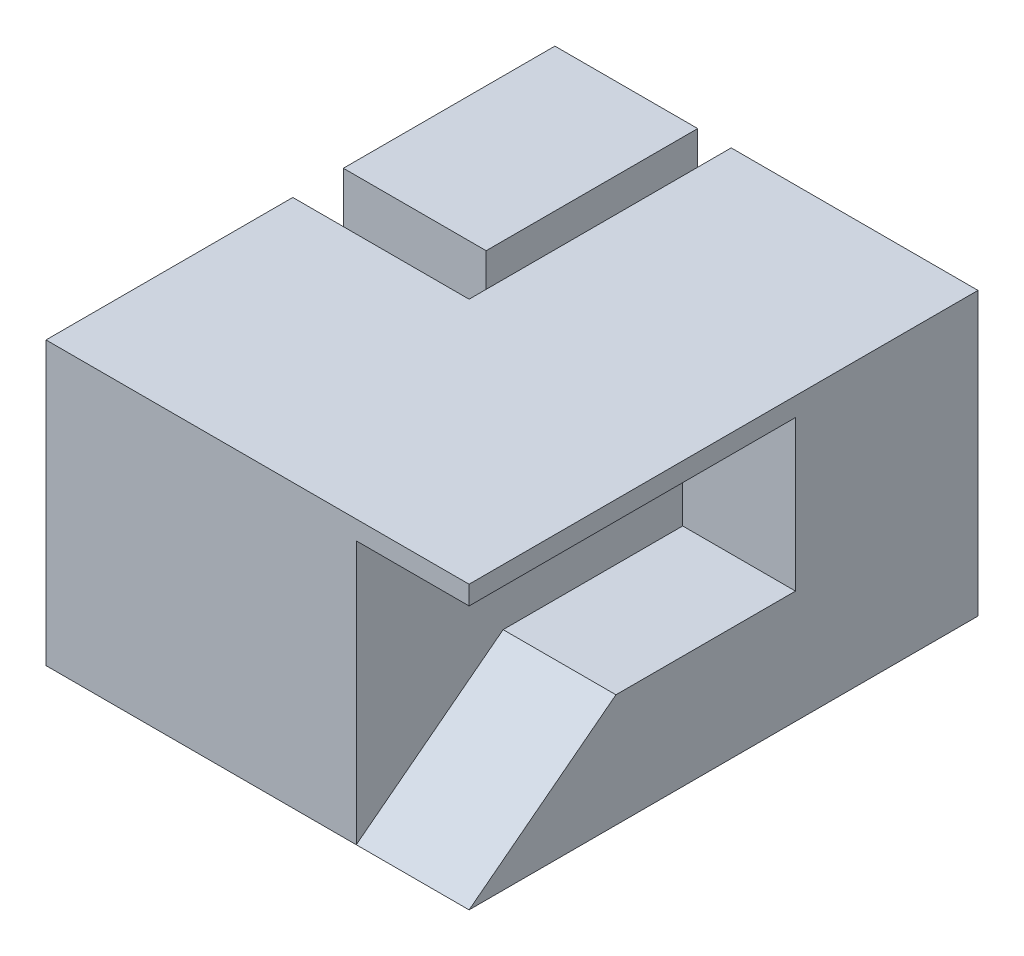
ISO-10303-21;
HEADER;
FILE_DESCRIPTION(('STEP AP214'),'2;1');
FILE_NAME('part.step','',(''),(''),'','','');
FILE_SCHEMA(('AUTOMOTIVE_DESIGN { 1 0 10303 214 1 1 1 1 }'));
ENDSEC;
DATA;
#1=APPLICATION_CONTEXT('core data for automotive mechanical design processes');
#2=APPLICATION_PROTOCOL_DEFINITION('international standard','automotive_design',2000,#1);
#3=PRODUCT_CONTEXT('',#1,'mechanical');
#4=PRODUCT('Part','Part','',(#3));
#5=PRODUCT_RELATED_PRODUCT_CATEGORY('part','',(#4));
#6=PRODUCT_DEFINITION_FORMATION('','',#4);
#7=PRODUCT_DEFINITION_CONTEXT('part definition',#1,'design');
#8=PRODUCT_DEFINITION('design','',#6,#7);
#9=PRODUCT_DEFINITION_SHAPE('','',#8);
#10=(LENGTH_UNIT() NAMED_UNIT(*) SI_UNIT(.MILLI.,.METRE.));
#11=(NAMED_UNIT(*) PLANE_ANGLE_UNIT() SI_UNIT($,.RADIAN.));
#12=(NAMED_UNIT(*) SI_UNIT($,.STERADIAN.) SOLID_ANGLE_UNIT());
#13=UNCERTAINTY_MEASURE_WITH_UNIT(LENGTH_MEASURE(1.E-05),#10,'distance_accuracy_value','');
#14=(GEOMETRIC_REPRESENTATION_CONTEXT(3) GLOBAL_UNCERTAINTY_ASSIGNED_CONTEXT((#13)) GLOBAL_UNIT_ASSIGNED_CONTEXT((#10,
#11,#12)) REPRESENTATION_CONTEXT('',''));
#15=CARTESIAN_POINT('',(0.,0.,0.));
#16=DIRECTION('',(0.,0.,1.));
#17=DIRECTION('',(1.,0.,0.));
#18=AXIS2_PLACEMENT_3D('',#15,#16,#17);
#19=CARTESIAN_POINT('',(-53.8660466781411,40.,-51.3447114218906));
#20=DIRECTION('',(1.,0.,0.));
#21=DIRECTION('',(0.,0.,-1.));
#22=AXIS2_PLACEMENT_3D('',#19,#20,#21);
#23=PLANE('',#22);
#24=DIRECTION('',(0.,0.,1.));
#25=VECTOR('',#24,1.);
#26=CARTESIAN_POINT('',(-53.8660466781411,0.,-51.3447114218906));
#27=LINE('',#26,#25);
#28=CARTESIAN_POINT('',(-53.8660466781411,0.,-51.3447114218906));
#29=VERTEX_POINT('',#28);
#30=CARTESIAN_POINT('',(-53.8660466781411,0.,-21.3447114218906));
#31=VERTEX_POINT('',#30);
#32=EDGE_CURVE('E108',#29,#31,#27,.T.);
#33=ORIENTED_EDGE('',*,*,#32,.T.);
#34=DIRECTION('',(0.,-1.,0.));
#35=VECTOR('',#34,1.);
#36=CARTESIAN_POINT('',(-53.8660466781411,40.,-21.3447114218906));
#37=LINE('',#36,#35);
#38=CARTESIAN_POINT('',(-53.8660466781411,40.,-21.3447114218906));
#39=VERTEX_POINT('',#38);
#40=EDGE_CURVE('E12',#39,#31,#37,.T.);
#41=ORIENTED_EDGE('',*,*,#40,.F.);
#42=DIRECTION('',(0.,0.,1.));
#43=VECTOR('',#42,1.);
#44=CARTESIAN_POINT('',(-53.8660466781411,40.,-51.3447114218906));
#45=LINE('',#44,#43);
#46=CARTESIAN_POINT('',(-53.8660466781411,40.,-51.3447114218906));
#47=VERTEX_POINT('',#46);
#48=EDGE_CURVE('E96',#47,#39,#45,.T.);
#49=ORIENTED_EDGE('',*,*,#48,.F.);
#50=DIRECTION('',(0.,-1.,0.));
#51=VECTOR('',#50,1.);
#52=CARTESIAN_POINT('',(-53.8660466781411,40.,-51.3447114218906));
#53=LINE('',#52,#51);
#54=EDGE_CURVE('E104',#47,#29,#53,.T.);
#55=ORIENTED_EDGE('',*,*,#54,.T.);
#56=EDGE_LOOP('',(#33,#41,#49,#55));
#57=FACE_BOUND('',#56,.T.);
#58=ADVANCED_FACE('F45',(#57),#23,.F.);
#59=CARTESIAN_POINT('',(-53.8660466781411,40.,-21.3447114218906));
#60=DIRECTION('',(0.,0.,-1.));
#61=DIRECTION('',(-1.,0.,0.));
#62=AXIS2_PLACEMENT_3D('',#59,#60,#61);
#63=PLANE('',#62);
#64=DIRECTION('',(1.,0.,0.));
#65=VECTOR('',#64,1.);
#66=CARTESIAN_POINT('',(-53.8660466781411,0.,-21.3447114218906));
#67=LINE('',#66,#65);
#68=CARTESIAN_POINT('',(-33.614452291161,0.,-21.3447114218906));
#69=VERTEX_POINT('',#68);
#70=EDGE_CURVE('E100',#31,#69,#67,.T.);
#71=ORIENTED_EDGE('',*,*,#70,.T.);
#72=DIRECTION('',(0.,-1.,0.));
#73=VECTOR('',#72,1.);
#74=CARTESIAN_POINT('',(-33.614452291161,40.,-21.3447114218906));
#75=LINE('',#74,#73);
#76=CARTESIAN_POINT('',(-33.614452291161,40.,-21.3447114218906));
#77=VERTEX_POINT('',#76);
#78=EDGE_CURVE('E53',#77,#69,#75,.T.);
#79=ORIENTED_EDGE('',*,*,#78,.F.);
#80=DIRECTION('',(1.,0.,0.));
#81=VECTOR('',#80,1.);
#82=CARTESIAN_POINT('',(-53.8660466781411,40.,-21.3447114218906));
#83=LINE('',#82,#81);
#84=EDGE_CURVE('E91',#39,#77,#83,.T.);
#85=ORIENTED_EDGE('',*,*,#84,.F.);
#86=ORIENTED_EDGE('',*,*,#40,.T.);
#87=EDGE_LOOP('',(#71,#79,#85,#86));
#88=FACE_BOUND('',#87,.T.);
#89=ADVANCED_FACE('F99',(#88),#63,.F.);
#90=CARTESIAN_POINT('',(-33.614452291161,40.,-51.3447114218906));
#91=DIRECTION('',(-1.,0.,0.));
#92=DIRECTION('',(0.,0.,1.));
#93=AXIS2_PLACEMENT_3D('',#90,#91,#92);
#94=PLANE('',#93);
#95=DIRECTION('',(0.,0.,-1.));
#96=VECTOR('',#95,1.);
#97=CARTESIAN_POINT('',(-33.614452291161,0.,-51.3447114218906));
#98=LINE('',#97,#96);
#99=CARTESIAN_POINT('',(-33.614452291161,0.,-51.3447114218906));
#100=VERTEX_POINT('',#99);
#101=EDGE_CURVE('E78',#69,#100,#98,.T.);
#102=ORIENTED_EDGE('',*,*,#101,.T.);
#103=DIRECTION('',(0.,-1.,0.));
#104=VECTOR('',#103,1.);
#105=CARTESIAN_POINT('',(-33.614452291161,40.,-51.3447114218906));
#106=LINE('',#105,#104);
#107=CARTESIAN_POINT('',(-33.614452291161,40.,-51.3447114218906));
#108=VERTEX_POINT('',#107);
#109=EDGE_CURVE('E101',#108,#100,#106,.T.);
#110=ORIENTED_EDGE('',*,*,#109,.F.);
#111=DIRECTION('',(0.,0.,-1.));
#112=VECTOR('',#111,1.);
#113=CARTESIAN_POINT('',(-33.614452291161,40.,-51.3447114218906));
#114=LINE('',#113,#112);
#115=EDGE_CURVE('E94',#77,#108,#114,.T.);
#116=ORIENTED_EDGE('',*,*,#115,.F.);
#117=ORIENTED_EDGE('',*,*,#78,.T.);
#118=EDGE_LOOP('',(#102,#110,#116,#117));
#119=FACE_BOUND('',#118,.T.);
#120=ADVANCED_FACE('F102',(#119),#94,.F.);
#121=CARTESIAN_POINT('',(-53.8660466781411,40.,-51.3447114218906));
#122=DIRECTION('',(0.,0.,1.));
#123=DIRECTION('',(1.,0.,0.));
#124=AXIS2_PLACEMENT_3D('',#121,#122,#123);
#125=PLANE('',#124);
#126=DIRECTION('',(-1.,0.,0.));
#127=VECTOR('',#126,1.);
#128=CARTESIAN_POINT('',(-53.8660466781411,0.,-51.3447114218906));
#129=LINE('',#128,#127);
#130=EDGE_CURVE('E84',#100,#29,#129,.T.);
#131=ORIENTED_EDGE('',*,*,#130,.T.);
#132=ORIENTED_EDGE('',*,*,#54,.F.);
#133=DIRECTION('',(-1.,0.,0.));
#134=VECTOR('',#133,1.);
#135=CARTESIAN_POINT('',(-53.8660466781411,40.,-51.3447114218906));
#136=LINE('',#135,#134);
#137=EDGE_CURVE('E61',#108,#47,#136,.T.);
#138=ORIENTED_EDGE('',*,*,#137,.F.);
#139=ORIENTED_EDGE('',*,*,#109,.T.);
#140=EDGE_LOOP('',(#131,#132,#138,#139));
#141=FACE_BOUND('',#140,.T.);
#142=ADVANCED_FACE('F115',(#141),#125,.F.);
#143=CARTESIAN_POINT('',(0.,40.,0.));
#144=DIRECTION('',(0.,1.,0.));
#145=DIRECTION('',(0.,0.,1.));
#146=AXIS2_PLACEMENT_3D('',#143,#144,#145);
#147=PLANE('',#146);
#148=ORIENTED_EDGE('',*,*,#48,.T.);
#149=ORIENTED_EDGE('',*,*,#84,.T.);
#150=ORIENTED_EDGE('',*,*,#115,.T.);
#151=ORIENTED_EDGE('',*,*,#137,.T.);
#152=EDGE_LOOP('',(#148,#149,#150,#151));
#153=FACE_BOUND('',#152,.T.);
#154=ADVANCED_FACE('F92',(#153),#147,.T.);
#155=CARTESIAN_POINT('',(0.,0.,0.));
#156=DIRECTION('',(0.,1.,0.));
#157=DIRECTION('',(0.,0.,1.));
#158=AXIS2_PLACEMENT_3D('',#155,#156,#157);
#159=PLANE('',#158);
#160=ORIENTED_EDGE('',*,*,#32,.F.);
#161=ORIENTED_EDGE('',*,*,#130,.F.);
#162=ORIENTED_EDGE('',*,*,#101,.F.);
#163=ORIENTED_EDGE('',*,*,#70,.F.);
#164=EDGE_LOOP('',(#160,#161,#162,#163));
#165=FACE_BOUND('',#164,.T.);
#166=ADVANCED_FACE('F118',(#165),#159,.F.);
#167=CLOSED_SHELL('',(#58,#89,#120,#142,#154,#166));
#168=MANIFOLD_SOLID_BREP('B2',#167);
#169=CARTESIAN_POINT('',(-28.8660466781411,40.,-14.1754974182444));
#170=DIRECTION('',(0.,0.,1.));
#171=DIRECTION('',(1.,0.,0.));
#172=AXIS2_PLACEMENT_3D('',#169,#170,#171);
#173=PLANE('',#172);
#174=DIRECTION('',(-1.,0.,0.));
#175=VECTOR('',#174,1.);
#176=CARTESIAN_POINT('',(-28.8660466781411,0.,-14.1754974182444));
#177=LINE('',#176,#175);
#178=CARTESIAN_POINT('',(-28.8660466781411,0.,-14.1754974182444));
#179=VERTEX_POINT('',#178);
#180=CARTESIAN_POINT('',(-53.8660466781411,0.,-14.1754974182444));
#181=VERTEX_POINT('',#180);
#182=EDGE_CURVE('E263',#179,#181,#177,.T.);
#183=ORIENTED_EDGE('',*,*,#182,.T.);
#184=DIRECTION('',(0.,-1.,0.));
#185=VECTOR('',#184,1.);
#186=CARTESIAN_POINT('',(-53.8660466781411,40.,-14.1754974182444));
#187=LINE('',#186,#185);
#188=CARTESIAN_POINT('',(-53.8660466781411,40.,-14.1754974182444));
#189=VERTEX_POINT('',#188);
#190=EDGE_CURVE('E43',#189,#181,#187,.T.);
#191=ORIENTED_EDGE('',*,*,#190,.F.);
#192=DIRECTION('',(-1.,0.,0.));
#193=VECTOR('',#192,1.);
#194=CARTESIAN_POINT('',(-28.8660466781411,40.,-14.1754974182444));
#195=LINE('',#194,#193);
#196=CARTESIAN_POINT('',(-28.8660466781411,40.,-14.1754974182444));
#197=VERTEX_POINT('',#196);
#198=EDGE_CURVE('E276',#197,#189,#195,.T.);
#199=ORIENTED_EDGE('',*,*,#198,.F.);
#200=DIRECTION('',(0.,-1.,0.));
#201=VECTOR('',#200,1.);
#202=CARTESIAN_POINT('',(-28.8660466781411,40.,-14.1754974182444));
#203=LINE('',#202,#201);
#204=EDGE_CURVE('E259',#197,#179,#203,.T.);
#205=ORIENTED_EDGE('',*,*,#204,.T.);
#206=EDGE_LOOP('',(#183,#191,#199,#205));
#207=FACE_BOUND('',#206,.T.);
#208=ADVANCED_FACE('F169',(#207),#173,.F.);
#209=CARTESIAN_POINT('',(-53.8660466781411,40.,-14.1754974182444));
#210=DIRECTION('',(1.,0.,0.));
#211=DIRECTION('',(0.,0.,-1.));
#212=AXIS2_PLACEMENT_3D('',#209,#210,#211);
#213=PLANE('',#212);
#214=DIRECTION('',(0.,0.,1.));
#215=VECTOR('',#214,1.);
#216=CARTESIAN_POINT('',(-53.8660466781411,0.,-14.1754974182444));
#217=LINE('',#216,#215);
#218=CARTESIAN_POINT('',(-53.8660466781411,0.,20.8245025817556));
#219=VERTEX_POINT('',#218);
#220=EDGE_CURVE('E266',#181,#219,#217,.T.);
#221=ORIENTED_EDGE('',*,*,#220,.T.);
#222=DIRECTION('',(0.,-1.,0.));
#223=VECTOR('',#222,1.);
#224=CARTESIAN_POINT('',(-53.8660466781411,40.,20.8245025817556));
#225=LINE('',#224,#223);
#226=CARTESIAN_POINT('',(-53.8660466781411,40.,20.8245025817556));
#227=VERTEX_POINT('',#226);
#228=EDGE_CURVE('E176',#227,#219,#225,.T.);
#229=ORIENTED_EDGE('',*,*,#228,.F.);
#230=DIRECTION('',(0.,0.,1.));
#231=VECTOR('',#230,1.);
#232=CARTESIAN_POINT('',(-53.8660466781411,40.,-14.1754974182444));
#233=LINE('',#232,#231);
#234=EDGE_CURVE('E224',#189,#227,#233,.T.);
#235=ORIENTED_EDGE('',*,*,#234,.F.);
#236=ORIENTED_EDGE('',*,*,#190,.T.);
#237=EDGE_LOOP('',(#221,#229,#235,#236));
#238=FACE_BOUND('',#237,.T.);
#239=ADVANCED_FACE('F306',(#238),#213,.F.);
#240=CARTESIAN_POINT('',(-53.8660466781411,40.,20.8245025817556));
#241=DIRECTION('',(0.,0.,-1.));
#242=DIRECTION('',(-1.,0.,0.));
#243=AXIS2_PLACEMENT_3D('',#240,#241,#242);
#244=PLANE('',#243);
#245=DIRECTION('',(0.,-1.,0.));
#246=VECTOR('',#245,1.);
#247=CARTESIAN_POINT('',(-9.86604667814108,37.3269318861504,20.8245025817556));
#248=LINE('',#247,#246);
#249=CARTESIAN_POINT('',(-9.86604667814108,37.3269318861504,20.8245025817556));
#250=VERTEX_POINT('',#249);
#251=CARTESIAN_POINT('',(-9.86604667814108,0.,20.8245025817556));
#252=VERTEX_POINT('',#251);
#253=EDGE_CURVE('E183',#250,#252,#248,.T.);
#254=ORIENTED_EDGE('',*,*,#253,.F.);
#255=DIRECTION('',(1.,0.,0.));
#256=VECTOR('',#255,1.);
#257=CARTESIAN_POINT('',(-9.86604667814108,37.3269318861504,20.8245025817556));
#258=LINE('',#257,#256);
#259=CARTESIAN_POINT('',(6.13395332185888,37.3269318861504,20.8245025817556));
#260=VERTEX_POINT('',#259);
#261=EDGE_CURVE('E267',#250,#260,#258,.T.);
#262=ORIENTED_EDGE('',*,*,#261,.T.);
#263=DIRECTION('',(0.,-1.,0.));
#264=VECTOR('',#263,1.);
#265=CARTESIAN_POINT('',(6.13395332185888,40.,20.8245025817556));
#266=LINE('',#265,#264);
#267=CARTESIAN_POINT('',(6.13395332185888,40.,20.8245025817556));
#268=VERTEX_POINT('',#267);
#269=EDGE_CURVE('E254',#268,#260,#266,.T.);
#270=ORIENTED_EDGE('',*,*,#269,.F.);
#271=DIRECTION('',(1.,0.,0.));
#272=VECTOR('',#271,1.);
#273=CARTESIAN_POINT('',(-53.8660466781411,40.,20.8245025817556));
#274=LINE('',#273,#272);
#275=EDGE_CURVE('E241',#227,#268,#274,.T.);
#276=ORIENTED_EDGE('',*,*,#275,.F.);
#277=ORIENTED_EDGE('',*,*,#228,.T.);
#278=DIRECTION('',(1.,0.,0.));
#279=VECTOR('',#278,1.);
#280=CARTESIAN_POINT('',(-53.8660466781411,0.,20.8245025817556));
#281=LINE('',#280,#279);
#282=EDGE_CURVE('E269',#219,#252,#281,.T.);
#283=ORIENTED_EDGE('',*,*,#282,.T.);
#284=EDGE_LOOP('',(#254,#262,#270,#276,#277,#283));
#285=FACE_BOUND('',#284,.T.);
#286=ADVANCED_FACE('F282',(#285),#244,.F.);
#287=CARTESIAN_POINT('',(6.13395332185888,40.,20.8245025817556));
#288=DIRECTION('',(-1.,0.,0.));
#289=DIRECTION('',(0.,0.,1.));
#290=AXIS2_PLACEMENT_3D('',#287,#288,#289);
#291=PLANE('',#290);
#292=ORIENTED_EDGE('',*,*,#269,.T.);
#293=DIRECTION('',(0.,0.,1.));
#294=VECTOR('',#293,1.);
#295=CARTESIAN_POINT('',(6.13395332185888,37.3269318861504,20.8245025817556));
#296=LINE('',#295,#294);
#297=CARTESIAN_POINT('',(6.13395332185888,37.3269318861504,-25.4654282128968));
#298=VERTEX_POINT('',#297);
#299=EDGE_CURVE('E422',#298,#260,#296,.T.);
#300=ORIENTED_EDGE('',*,*,#299,.F.);
#301=DIRECTION('',(0.,1.,0.));
#302=VECTOR('',#301,1.);
#303=CARTESIAN_POINT('',(6.13395332185888,37.3269318861504,-25.4654282128968));
#304=LINE('',#303,#302);
#305=CARTESIAN_POINT('',(6.13395332185888,16.0069599925974,-25.4654282128968));
#306=VERTEX_POINT('',#305);
#307=EDGE_CURVE('E431',#306,#298,#304,.T.);
#308=ORIENTED_EDGE('',*,*,#307,.F.);
#309=DIRECTION('',(0.,0.,-1.));
#310=VECTOR('',#309,1.);
#311=CARTESIAN_POINT('',(6.13395332185888,16.0069599925974,0.));
#312=LINE('',#311,#310);
#313=CARTESIAN_POINT('',(6.13395332185888,16.0069599925974,0.));
#314=VERTEX_POINT('',#313);
#315=EDGE_CURVE('E448',#314,#306,#312,.T.);
#316=ORIENTED_EDGE('',*,*,#315,.F.);
#317=DIRECTION('',(0.,0.609426366541782,-0.79284267276912));
#318=VECTOR('',#317,1.);
#319=CARTESIAN_POINT('',(6.13395332185888,0.,20.8245025817556));
#320=LINE('',#319,#318);
#321=CARTESIAN_POINT('',(6.13395332185888,0.,20.8245025817556));
#322=VERTEX_POINT('',#321);
#323=EDGE_CURVE('E450',#322,#314,#320,.T.);
#324=ORIENTED_EDGE('',*,*,#323,.F.);
#325=DIRECTION('',(0.,0.,-1.));
#326=VECTOR('',#325,1.);
#327=CARTESIAN_POINT('',(6.13395332185888,0.,20.8245025817556));
#328=LINE('',#327,#326);
#329=CARTESIAN_POINT('',(6.13395332185888,0.,-51.3447114218906));
#330=VERTEX_POINT('',#329);
#331=EDGE_CURVE('E251',#322,#330,#328,.T.);
#332=ORIENTED_EDGE('',*,*,#331,.T.);
#333=DIRECTION('',(0.,-1.,0.));
#334=VECTOR('',#333,1.);
#335=CARTESIAN_POINT('',(6.13395332185888,40.,-51.3447114218906));
#336=LINE('',#335,#334);
#337=CARTESIAN_POINT('',(6.13395332185888,40.,-51.3447114218906));
#338=VERTEX_POINT('',#337);
#339=EDGE_CURVE('E247',#338,#330,#336,.T.);
#340=ORIENTED_EDGE('',*,*,#339,.F.);
#341=DIRECTION('',(0.,0.,-1.));
#342=VECTOR('',#341,1.);
#343=CARTESIAN_POINT('',(6.13395332185888,40.,20.8245025817556));
#344=LINE('',#343,#342);
#345=EDGE_CURVE('E234',#268,#338,#344,.T.);
#346=ORIENTED_EDGE('',*,*,#345,.F.);
#347=EDGE_LOOP('',(#292,#300,#308,#316,#324,#332,#340,#346));
#348=FACE_BOUND('',#347,.T.);
#349=ADVANCED_FACE('F248',(#348),#291,.F.);
#350=CARTESIAN_POINT('',(6.13395332185888,40.,-51.3447114218906));
#351=DIRECTION('',(0.,0.,1.));
#352=DIRECTION('',(1.,0.,0.));
#353=AXIS2_PLACEMENT_3D('',#350,#351,#352);
#354=PLANE('',#353);
#355=DIRECTION('',(-1.,0.,0.));
#356=VECTOR('',#355,1.);
#357=CARTESIAN_POINT('',(6.13395332185888,0.,-51.3447114218906));
#358=LINE('',#357,#356);
#359=CARTESIAN_POINT('',(-28.8660466781411,0.,-51.3447114218906));
#360=VERTEX_POINT('',#359);
#361=EDGE_CURVE('E273',#330,#360,#358,.T.);
#362=ORIENTED_EDGE('',*,*,#361,.T.);
#363=DIRECTION('',(0.,-1.,0.));
#364=VECTOR('',#363,1.);
#365=CARTESIAN_POINT('',(-28.8660466781411,40.,-51.3447114218906));
#366=LINE('',#365,#364);
#367=CARTESIAN_POINT('',(-28.8660466781411,40.,-51.3447114218906));
#368=VERTEX_POINT('',#367);
#369=EDGE_CURVE('E255',#368,#360,#366,.T.);
#370=ORIENTED_EDGE('',*,*,#369,.F.);
#371=DIRECTION('',(-1.,0.,0.));
#372=VECTOR('',#371,1.);
#373=CARTESIAN_POINT('',(6.13395332185888,40.,-51.3447114218906));
#374=LINE('',#373,#372);
#375=EDGE_CURVE('E238',#338,#368,#374,.T.);
#376=ORIENTED_EDGE('',*,*,#375,.F.);
#377=ORIENTED_EDGE('',*,*,#339,.T.);
#378=EDGE_LOOP('',(#362,#370,#376,#377));
#379=FACE_BOUND('',#378,.T.);
#380=ADVANCED_FACE('F257',(#379),#354,.F.);
#381=CARTESIAN_POINT('',(-28.8660466781411,40.,-51.3447114218906));
#382=DIRECTION('',(1.,0.,0.));
#383=DIRECTION('',(0.,0.,-1.));
#384=AXIS2_PLACEMENT_3D('',#381,#382,#383);
#385=PLANE('',#384);
#386=DIRECTION('',(0.,0.,1.));
#387=VECTOR('',#386,1.);
#388=CARTESIAN_POINT('',(-28.8660466781411,0.,-51.3447114218906));
#389=LINE('',#388,#387);
#390=EDGE_CURVE('E216',#360,#179,#389,.T.);
#391=ORIENTED_EDGE('',*,*,#390,.T.);
#392=ORIENTED_EDGE('',*,*,#204,.F.);
#393=DIRECTION('',(0.,0.,1.));
#394=VECTOR('',#393,1.);
#395=CARTESIAN_POINT('',(-28.8660466781411,40.,-51.3447114218906));
#396=LINE('',#395,#394);
#397=EDGE_CURVE('E192',#368,#197,#396,.T.);
#398=ORIENTED_EDGE('',*,*,#397,.F.);
#399=ORIENTED_EDGE('',*,*,#369,.T.);
#400=EDGE_LOOP('',(#391,#392,#398,#399));
#401=FACE_BOUND('',#400,.T.);
#402=ADVANCED_FACE('F318',(#401),#385,.F.);
#403=CARTESIAN_POINT('',(0.,40.,0.));
#404=DIRECTION('',(0.,1.,0.));
#405=DIRECTION('',(0.,0.,1.));
#406=AXIS2_PLACEMENT_3D('',#403,#404,#405);
#407=PLANE('',#406);
#408=ORIENTED_EDGE('',*,*,#198,.T.);
#409=ORIENTED_EDGE('',*,*,#234,.T.);
#410=ORIENTED_EDGE('',*,*,#275,.T.);
#411=ORIENTED_EDGE('',*,*,#345,.T.);
#412=ORIENTED_EDGE('',*,*,#375,.T.);
#413=ORIENTED_EDGE('',*,*,#397,.T.);
#414=EDGE_LOOP('',(#408,#409,#410,#411,#412,#413));
#415=FACE_BOUND('',#414,.T.);
#416=ADVANCED_FACE('F236',(#415),#407,.T.);
#417=CARTESIAN_POINT('',(0.,0.,0.));
#418=DIRECTION('',(0.,1.,0.));
#419=DIRECTION('',(0.,0.,1.));
#420=AXIS2_PLACEMENT_3D('',#417,#418,#419);
#421=PLANE('',#420);
#422=ORIENTED_EDGE('',*,*,#182,.F.);
#423=ORIENTED_EDGE('',*,*,#390,.F.);
#424=ORIENTED_EDGE('',*,*,#361,.F.);
#425=ORIENTED_EDGE('',*,*,#331,.F.);
#426=DIRECTION('',(1.,0.,0.));
#427=VECTOR('',#426,1.);
#428=CARTESIAN_POINT('',(-9.86604667814108,0.,20.8245025817556));
#429=LINE('',#428,#427);
#430=EDGE_CURVE('E288',#252,#322,#429,.T.);
#431=ORIENTED_EDGE('',*,*,#430,.F.);
#432=ORIENTED_EDGE('',*,*,#282,.F.);
#433=ORIENTED_EDGE('',*,*,#220,.F.);
#434=EDGE_LOOP('',(#422,#423,#424,#425,#431,#432,#433));
#435=FACE_BOUND('',#434,.T.);
#436=ADVANCED_FACE('F286',(#435),#421,.F.);
#437=CARTESIAN_POINT('',(-9.86604667814108,37.3269318861504,20.8245025817556));
#438=DIRECTION('',(0.,1.,0.));
#439=DIRECTION('',(0.,0.,1.));
#440=AXIS2_PLACEMENT_3D('',#437,#438,#439);
#441=PLANE('',#440);
#442=ORIENTED_EDGE('',*,*,#299,.T.);
#443=ORIENTED_EDGE('',*,*,#261,.F.);
#444=DIRECTION('',(0.,0.,1.));
#445=VECTOR('',#444,1.);
#446=CARTESIAN_POINT('',(-9.86604667814108,37.3269318861504,20.8245025817556));
#447=LINE('',#446,#445);
#448=CARTESIAN_POINT('',(-9.86604667814108,37.3269318861504,-25.4654282128968));
#449=VERTEX_POINT('',#448);
#450=EDGE_CURVE('E293',#449,#250,#447,.T.);
#451=ORIENTED_EDGE('',*,*,#450,.F.);
#452=DIRECTION('',(1.,0.,0.));
#453=VECTOR('',#452,1.);
#454=CARTESIAN_POINT('',(-9.86604667814108,37.3269318861504,-25.4654282128968));
#455=LINE('',#454,#453);
#456=EDGE_CURVE('E427',#449,#298,#455,.T.);
#457=ORIENTED_EDGE('',*,*,#456,.T.);
#458=EDGE_LOOP('',(#442,#443,#451,#457));
#459=FACE_BOUND('',#458,.T.);
#460=ADVANCED_FACE('F323',(#459),#441,.F.);
#461=CARTESIAN_POINT('',(-9.86604667814108,37.3269318861504,-25.4654282128968));
#462=DIRECTION('',(0.,0.,-1.));
#463=DIRECTION('',(-1.,0.,0.));
#464=AXIS2_PLACEMENT_3D('',#461,#462,#463);
#465=PLANE('',#464);
#466=ORIENTED_EDGE('',*,*,#307,.T.);
#467=ORIENTED_EDGE('',*,*,#456,.F.);
#468=DIRECTION('',(0.,1.,0.));
#469=VECTOR('',#468,1.);
#470=CARTESIAN_POINT('',(-9.86604667814108,37.3269318861504,-25.4654282128968));
#471=LINE('',#470,#469);
#472=CARTESIAN_POINT('',(-9.86604667814108,16.0069599925974,-25.4654282128968));
#473=VERTEX_POINT('',#472);
#474=EDGE_CURVE('E298',#473,#449,#471,.T.);
#475=ORIENTED_EDGE('',*,*,#474,.F.);
#476=DIRECTION('',(1.,0.,0.));
#477=VECTOR('',#476,1.);
#478=CARTESIAN_POINT('',(-9.86604667814108,16.0069599925974,-25.4654282128968));
#479=LINE('',#478,#477);
#480=EDGE_CURVE('E296',#473,#306,#479,.T.);
#481=ORIENTED_EDGE('',*,*,#480,.T.);
#482=EDGE_LOOP('',(#466,#467,#475,#481));
#483=FACE_BOUND('',#482,.T.);
#484=ADVANCED_FACE('F333',(#483),#465,.F.);
#485=CARTESIAN_POINT('',(-9.86604667814108,16.0069599925974,0.));
#486=DIRECTION('',(0.,-1.,0.));
#487=DIRECTION('',(0.,0.,-1.));
#488=AXIS2_PLACEMENT_3D('',#485,#486,#487);
#489=PLANE('',#488);
#490=ORIENTED_EDGE('',*,*,#315,.T.);
#491=ORIENTED_EDGE('',*,*,#480,.F.);
#492=DIRECTION('',(0.,0.,-1.));
#493=VECTOR('',#492,1.);
#494=CARTESIAN_POINT('',(-9.86604667814108,16.0069599925974,0.));
#495=LINE('',#494,#493);
#496=CARTESIAN_POINT('',(-9.86604667814108,16.0069599925974,0.));
#497=VERTEX_POINT('',#496);
#498=EDGE_CURVE('E455',#497,#473,#495,.T.);
#499=ORIENTED_EDGE('',*,*,#498,.F.);
#500=DIRECTION('',(1.,0.,0.));
#501=VECTOR('',#500,1.);
#502=CARTESIAN_POINT('',(-9.86604667814108,16.0069599925974,0.));
#503=LINE('',#502,#501);
#504=EDGE_CURVE('E292',#497,#314,#503,.T.);
#505=ORIENTED_EDGE('',*,*,#504,.T.);
#506=EDGE_LOOP('',(#490,#491,#499,#505));
#507=FACE_BOUND('',#506,.T.);
#508=ADVANCED_FACE('F330',(#507),#489,.F.);
#509=CARTESIAN_POINT('',(-9.86604667814108,0.,20.8245025817556));
#510=DIRECTION('',(0.,-0.79284267276912,-0.609426366541782));
#511=DIRECTION('',(0.,0.609426366541782,-0.79284267276912));
#512=AXIS2_PLACEMENT_3D('',#509,#510,#511);
#513=PLANE('',#512);
#514=ORIENTED_EDGE('',*,*,#323,.T.);
#515=ORIENTED_EDGE('',*,*,#504,.F.);
#516=DIRECTION('',(0.,0.609426366541782,-0.79284267276912));
#517=VECTOR('',#516,1.);
#518=CARTESIAN_POINT('',(-9.86604667814108,0.,20.8245025817556));
#519=LINE('',#518,#517);
#520=EDGE_CURVE('E457',#252,#497,#519,.T.);
#521=ORIENTED_EDGE('',*,*,#520,.F.);
#522=ORIENTED_EDGE('',*,*,#430,.T.);
#523=EDGE_LOOP('',(#514,#515,#521,#522));
#524=FACE_BOUND('',#523,.T.);
#525=ADVANCED_FACE('F326',(#524),#513,.F.);
#526=CARTESIAN_POINT('',(-9.86604667814108,0.,0.));
#527=DIRECTION('',(1.,0.,0.));
#528=DIRECTION('',(0.,0.,-1.));
#529=AXIS2_PLACEMENT_3D('',#526,#527,#528);
#530=PLANE('',#529);
#531=ORIENTED_EDGE('',*,*,#253,.T.);
#532=ORIENTED_EDGE('',*,*,#520,.T.);
#533=ORIENTED_EDGE('',*,*,#498,.T.);
#534=ORIENTED_EDGE('',*,*,#474,.T.);
#535=ORIENTED_EDGE('',*,*,#450,.T.);
#536=EDGE_LOOP('',(#531,#532,#533,#534,#535));
#537=FACE_BOUND('',#536,.T.);
#538=ADVANCED_FACE('F329',(#537),#530,.T.);
#539=CLOSED_SHELL('',(#208,#239,#286,#349,#380,#402,#416,#436,#460,#484,#508,#525,#538));
#540=MANIFOLD_SOLID_BREP('B6',#539);
#541=ADVANCED_BREP_SHAPE_REPRESENTATION('',(#18,#168,#540),#14);
#542=SHAPE_DEFINITION_REPRESENTATION(#9,#541);
ENDSEC;
END-ISO-10303-21;
